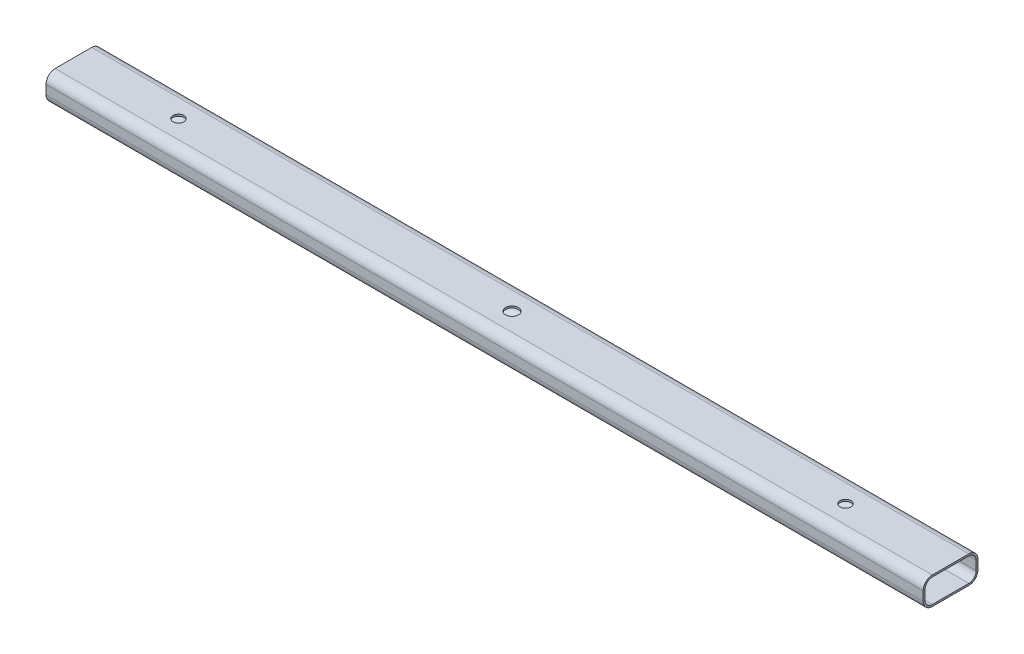
ISO-10303-21;
HEADER;
FILE_DESCRIPTION(('STEP AP214'),'2;1');
FILE_NAME('part.step','',(''),(''),'','','');
FILE_SCHEMA(('AUTOMOTIVE_DESIGN { 1 0 10303 214 1 1 1 1 }'));
ENDSEC;
DATA;
#1=APPLICATION_CONTEXT('core data for automotive mechanical design processes');
#2=APPLICATION_PROTOCOL_DEFINITION('international standard','automotive_design',2000,#1);
#3=PRODUCT_CONTEXT('',#1,'mechanical');
#4=PRODUCT('Part','Part','',(#3));
#5=PRODUCT_RELATED_PRODUCT_CATEGORY('part','',(#4));
#6=PRODUCT_DEFINITION_FORMATION('','',#4);
#7=PRODUCT_DEFINITION_CONTEXT('part definition',#1,'design');
#8=PRODUCT_DEFINITION('design','',#6,#7);
#9=PRODUCT_DEFINITION_SHAPE('','',#8);
#10=(LENGTH_UNIT() NAMED_UNIT(*) SI_UNIT(.MILLI.,.METRE.));
#11=(NAMED_UNIT(*) PLANE_ANGLE_UNIT() SI_UNIT($,.RADIAN.));
#12=(NAMED_UNIT(*) SI_UNIT($,.STERADIAN.) SOLID_ANGLE_UNIT());
#13=UNCERTAINTY_MEASURE_WITH_UNIT(LENGTH_MEASURE(1.E-05),#10,'distance_accuracy_value','');
#14=(GEOMETRIC_REPRESENTATION_CONTEXT(3) GLOBAL_UNCERTAINTY_ASSIGNED_CONTEXT((#13)) GLOBAL_UNIT_ASSIGNED_CONTEXT((#10,
#11,#12)) REPRESENTATION_CONTEXT('',''));
#15=CARTESIAN_POINT('',(0.,0.,0.));
#16=DIRECTION('',(0.,0.,1.));
#17=DIRECTION('',(1.,0.,0.));
#18=AXIS2_PLACEMENT_3D('',#15,#16,#17);
#19=CARTESIAN_POINT('',(480.,2.5,10.));
#20=DIRECTION('',(1.,0.,0.));
#21=DIRECTION('',(0.,0.,-1.));
#22=AXIS2_PLACEMENT_3D('',#19,#20,#21);
#23=PLANE('',#22);
#24=CARTESIAN_POINT('',(480.,2.5,10.));
#25=DIRECTION('',(1.,0.,0.));
#26=DIRECTION('',(0.,0.,1.));
#27=AXIS2_PLACEMENT_3D('',#24,#25,#26);
#28=CIRCLE('',#27,5.);
#29=CARTESIAN_POINT('',(480.,7.5,9.99999999999997));
#30=VERTEX_POINT('',#29);
#31=CARTESIAN_POINT('',(480.,2.49999999999996,15.));
#32=VERTEX_POINT('',#31);
#33=EDGE_CURVE('E264',#30,#32,#28,.T.);
#34=ORIENTED_EDGE('',*,*,#33,.T.);
#35=DIRECTION('',(0.,-1.,0.));
#36=VECTOR('',#35,1.);
#37=CARTESIAN_POINT('',(480.,-2.49999999999997,15.));
#38=LINE('',#37,#36);
#39=CARTESIAN_POINT('',(480.,-2.49999999999997,15.));
#40=VERTEX_POINT('',#39);
#41=EDGE_CURVE('E267',#32,#40,#38,.T.);
#42=ORIENTED_EDGE('',*,*,#41,.T.);
#43=CARTESIAN_POINT('',(480.,-2.5,10.));
#44=DIRECTION('',(1.,0.,0.));
#45=DIRECTION('',(0.,0.,1.));
#46=AXIS2_PLACEMENT_3D('',#43,#44,#45);
#47=CIRCLE('',#46,5.);
#48=CARTESIAN_POINT('',(480.,-7.5,9.99999999999996));
#49=VERTEX_POINT('',#48);
#50=EDGE_CURVE('E270',#40,#49,#47,.T.);
#51=ORIENTED_EDGE('',*,*,#50,.T.);
#52=DIRECTION('',(0.,0.,-1.));
#53=VECTOR('',#52,1.);
#54=CARTESIAN_POINT('',(480.,-7.5,9.99999999999997));
#55=LINE('',#54,#53);
#56=CARTESIAN_POINT('',(480.,-7.5,-9.99999999999996));
#57=VERTEX_POINT('',#56);
#58=EDGE_CURVE('E272',#49,#57,#55,.T.);
#59=ORIENTED_EDGE('',*,*,#58,.T.);
#60=CARTESIAN_POINT('',(480.,-2.5,-10.));
#61=DIRECTION('',(1.,0.,0.));
#62=DIRECTION('',(0.,0.,-1.));
#63=AXIS2_PLACEMENT_3D('',#60,#61,#62);
#64=CIRCLE('',#63,5.);
#65=CARTESIAN_POINT('',(480.,-2.5,-15.));
#66=VERTEX_POINT('',#65);
#67=EDGE_CURVE('E274',#57,#66,#64,.T.);
#68=ORIENTED_EDGE('',*,*,#67,.T.);
#69=DIRECTION('',(0.,1.,0.));
#70=VECTOR('',#69,1.);
#71=CARTESIAN_POINT('',(480.,-2.49999999999996,-15.));
#72=LINE('',#71,#70);
#73=CARTESIAN_POINT('',(480.,2.49999999999996,-15.));
#74=VERTEX_POINT('',#73);
#75=EDGE_CURVE('E276',#66,#74,#72,.T.);
#76=ORIENTED_EDGE('',*,*,#75,.T.);
#77=CARTESIAN_POINT('',(480.,2.5,-10.));
#78=DIRECTION('',(1.,0.,0.));
#79=DIRECTION('',(0.,0.,1.));
#80=AXIS2_PLACEMENT_3D('',#77,#78,#79);
#81=CIRCLE('',#80,5.);
#82=CARTESIAN_POINT('',(480.,7.5,-9.99999999999996));
#83=VERTEX_POINT('',#82);
#84=EDGE_CURVE('E278',#74,#83,#81,.T.);
#85=ORIENTED_EDGE('',*,*,#84,.T.);
#86=DIRECTION('',(0.,0.,1.));
#87=VECTOR('',#86,1.);
#88=CARTESIAN_POINT('',(480.,7.5,9.99999999999997));
#89=LINE('',#88,#87);
#90=EDGE_CURVE('E280',#83,#30,#89,.T.);
#91=ORIENTED_EDGE('',*,*,#90,.T.);
#92=EDGE_LOOP('',(#34,#42,#51,#59,#68,#76,#85,#91));
#93=FACE_BOUND('',#92,.T.);
#94=DIRECTION('',(0.,-1.,0.));
#95=VECTOR('',#94,1.);
#96=CARTESIAN_POINT('',(480.,2.5,14.));
#97=LINE('',#96,#95);
#98=CARTESIAN_POINT('',(480.,2.49999999999996,14.));
#99=VERTEX_POINT('',#98);
#100=CARTESIAN_POINT('',(480.,-2.49999999999997,14.));
#101=VERTEX_POINT('',#100);
#102=EDGE_CURVE('E205',#99,#101,#97,.T.);
#103=ORIENTED_EDGE('',*,*,#102,.F.);
#104=CARTESIAN_POINT('',(480.,2.5,10.));
#105=DIRECTION('',(-1.,0.,0.));
#106=DIRECTION('',(0.,0.,1.));
#107=AXIS2_PLACEMENT_3D('',#104,#105,#106);
#108=CIRCLE('',#107,4.);
#109=CARTESIAN_POINT('',(480.,6.5,9.99999999999997));
#110=VERTEX_POINT('',#109);
#111=EDGE_CURVE('E197',#110,#99,#108,.F.);
#112=ORIENTED_EDGE('',*,*,#111,.F.);
#113=DIRECTION('',(0.,0.,1.));
#114=VECTOR('',#113,1.);
#115=CARTESIAN_POINT('',(480.,6.5,10.));
#116=LINE('',#115,#114);
#117=CARTESIAN_POINT('',(480.,6.5,-9.99999999999997));
#118=VERTEX_POINT('',#117);
#119=EDGE_CURVE('E231',#118,#110,#116,.T.);
#120=ORIENTED_EDGE('',*,*,#119,.F.);
#121=CARTESIAN_POINT('',(480.,2.5,-10.));
#122=DIRECTION('',(-1.,0.,0.));
#123=DIRECTION('',(0.,0.,1.));
#124=AXIS2_PLACEMENT_3D('',#121,#122,#123);
#125=CIRCLE('',#124,4.);
#126=CARTESIAN_POINT('',(480.,2.49999999999996,-14.));
#127=VERTEX_POINT('',#126);
#128=EDGE_CURVE('E229',#127,#118,#125,.F.);
#129=ORIENTED_EDGE('',*,*,#128,.F.);
#130=DIRECTION('',(0.,1.,0.));
#131=VECTOR('',#130,1.);
#132=CARTESIAN_POINT('',(480.,2.5,-14.));
#133=LINE('',#132,#131);
#134=CARTESIAN_POINT('',(480.,-2.5,-14.));
#135=VERTEX_POINT('',#134);
#136=EDGE_CURVE('E227',#135,#127,#133,.T.);
#137=ORIENTED_EDGE('',*,*,#136,.F.);
#138=CARTESIAN_POINT('',(480.,-2.5,-10.));
#139=DIRECTION('',(-1.,0.,0.));
#140=DIRECTION('',(0.,0.,1.));
#141=AXIS2_PLACEMENT_3D('',#138,#139,#140);
#142=CIRCLE('',#141,4.);
#143=CARTESIAN_POINT('',(480.,-6.5,-9.99999999999996));
#144=VERTEX_POINT('',#143);
#145=EDGE_CURVE('E225',#144,#135,#142,.F.);
#146=ORIENTED_EDGE('',*,*,#145,.F.);
#147=DIRECTION('',(0.,0.,-1.));
#148=VECTOR('',#147,1.);
#149=CARTESIAN_POINT('',(480.,-6.5,10.));
#150=LINE('',#149,#148);
#151=CARTESIAN_POINT('',(480.,-6.5,9.99999999999997));
#152=VERTEX_POINT('',#151);
#153=EDGE_CURVE('E220',#152,#144,#150,.T.);
#154=ORIENTED_EDGE('',*,*,#153,.F.);
#155=CARTESIAN_POINT('',(480.,-2.5,10.));
#156=DIRECTION('',(-1.,0.,0.));
#157=DIRECTION('',(0.,0.,1.));
#158=AXIS2_PLACEMENT_3D('',#155,#156,#157);
#159=CIRCLE('',#158,4.);
#160=EDGE_CURVE('E218',#101,#152,#159,.F.);
#161=ORIENTED_EDGE('',*,*,#160,.F.);
#162=EDGE_LOOP('',(#103,#112,#120,#129,#137,#146,#154,#161));
#163=FACE_BOUND('',#162,.T.);
#164=ADVANCED_FACE('F82',(#93,#163),#23,.T.);
#165=CARTESIAN_POINT('',(0.,2.5,10.));
#166=DIRECTION('',(1.,0.,0.));
#167=DIRECTION('',(0.,0.,-1.));
#168=AXIS2_PLACEMENT_3D('',#165,#166,#167);
#169=PLANE('',#168);
#170=CARTESIAN_POINT('',(0.,2.5,10.));
#171=DIRECTION('',(1.,0.,0.));
#172=DIRECTION('',(0.,0.,1.));
#173=AXIS2_PLACEMENT_3D('',#170,#171,#172);
#174=CIRCLE('',#173,5.);
#175=CARTESIAN_POINT('',(0.,7.5,9.99999999999997));
#176=VERTEX_POINT('',#175);
#177=CARTESIAN_POINT('',(0.,2.49999999999996,15.));
#178=VERTEX_POINT('',#177);
#179=EDGE_CURVE('E213',#176,#178,#174,.T.);
#180=ORIENTED_EDGE('',*,*,#179,.F.);
#181=DIRECTION('',(0.,0.,1.));
#182=VECTOR('',#181,1.);
#183=CARTESIAN_POINT('',(0.,7.5,9.99999999999997));
#184=LINE('',#183,#182);
#185=CARTESIAN_POINT('',(0.,7.5,-9.99999999999996));
#186=VERTEX_POINT('',#185);
#187=EDGE_CURVE('E268',#186,#176,#184,.T.);
#188=ORIENTED_EDGE('',*,*,#187,.F.);
#189=CARTESIAN_POINT('',(0.,2.5,-10.));
#190=DIRECTION('',(1.,0.,0.));
#191=DIRECTION('',(0.,0.,1.));
#192=AXIS2_PLACEMENT_3D('',#189,#190,#191);
#193=CIRCLE('',#192,5.);
#194=CARTESIAN_POINT('',(0.,2.49999999999996,-15.));
#195=VERTEX_POINT('',#194);
#196=EDGE_CURVE('E295',#195,#186,#193,.T.);
#197=ORIENTED_EDGE('',*,*,#196,.F.);
#198=DIRECTION('',(0.,1.,0.));
#199=VECTOR('',#198,1.);
#200=CARTESIAN_POINT('',(0.,-2.49999999999996,-15.));
#201=LINE('',#200,#199);
#202=CARTESIAN_POINT('',(0.,-2.5,-15.));
#203=VERTEX_POINT('',#202);
#204=EDGE_CURVE('E293',#203,#195,#201,.T.);
#205=ORIENTED_EDGE('',*,*,#204,.F.);
#206=CARTESIAN_POINT('',(0.,-2.5,-10.));
#207=DIRECTION('',(1.,0.,0.));
#208=DIRECTION('',(0.,0.,-1.));
#209=AXIS2_PLACEMENT_3D('',#206,#207,#208);
#210=CIRCLE('',#209,5.);
#211=CARTESIAN_POINT('',(0.,-7.5,-9.99999999999996));
#212=VERTEX_POINT('',#211);
#213=EDGE_CURVE('E291',#212,#203,#210,.T.);
#214=ORIENTED_EDGE('',*,*,#213,.F.);
#215=DIRECTION('',(0.,0.,-1.));
#216=VECTOR('',#215,1.);
#217=CARTESIAN_POINT('',(0.,-7.5,9.99999999999997));
#218=LINE('',#217,#216);
#219=CARTESIAN_POINT('',(0.,-7.5,9.99999999999996));
#220=VERTEX_POINT('',#219);
#221=EDGE_CURVE('E289',#220,#212,#218,.T.);
#222=ORIENTED_EDGE('',*,*,#221,.F.);
#223=CARTESIAN_POINT('',(0.,-2.5,10.));
#224=DIRECTION('',(1.,0.,0.));
#225=DIRECTION('',(0.,0.,1.));
#226=AXIS2_PLACEMENT_3D('',#223,#224,#225);
#227=CIRCLE('',#226,5.);
#228=CARTESIAN_POINT('',(0.,-2.49999999999997,15.));
#229=VERTEX_POINT('',#228);
#230=EDGE_CURVE('E287',#229,#220,#227,.T.);
#231=ORIENTED_EDGE('',*,*,#230,.F.);
#232=DIRECTION('',(0.,-1.,0.));
#233=VECTOR('',#232,1.);
#234=CARTESIAN_POINT('',(0.,-2.49999999999997,15.));
#235=LINE('',#234,#233);
#236=EDGE_CURVE('E285',#178,#229,#235,.T.);
#237=ORIENTED_EDGE('',*,*,#236,.F.);
#238=EDGE_LOOP('',(#180,#188,#197,#205,#214,#222,#231,#237));
#239=FACE_BOUND('',#238,.T.);
#240=CARTESIAN_POINT('',(0.,2.5,10.));
#241=DIRECTION('',(-1.,0.,0.));
#242=DIRECTION('',(0.,0.,1.));
#243=AXIS2_PLACEMENT_3D('',#240,#241,#242);
#244=CIRCLE('',#243,4.);
#245=CARTESIAN_POINT('',(0.,6.5,9.99999999999997));
#246=VERTEX_POINT('',#245);
#247=CARTESIAN_POINT('',(0.,2.49999999999996,14.));
#248=VERTEX_POINT('',#247);
#249=EDGE_CURVE('E107',#246,#248,#244,.F.);
#250=ORIENTED_EDGE('',*,*,#249,.T.);
#251=DIRECTION('',(0.,-1.,0.));
#252=VECTOR('',#251,1.);
#253=CARTESIAN_POINT('',(0.,2.5,14.));
#254=LINE('',#253,#252);
#255=CARTESIAN_POINT('',(0.,-2.49999999999997,14.));
#256=VERTEX_POINT('',#255);
#257=EDGE_CURVE('E212',#248,#256,#254,.T.);
#258=ORIENTED_EDGE('',*,*,#257,.T.);
#259=CARTESIAN_POINT('',(0.,-2.5,10.));
#260=DIRECTION('',(-1.,0.,0.));
#261=DIRECTION('',(0.,0.,1.));
#262=AXIS2_PLACEMENT_3D('',#259,#260,#261);
#263=CIRCLE('',#262,4.);
#264=CARTESIAN_POINT('',(0.,-6.5,9.99999999999997));
#265=VERTEX_POINT('',#264);
#266=EDGE_CURVE('E236',#256,#265,#263,.F.);
#267=ORIENTED_EDGE('',*,*,#266,.T.);
#268=DIRECTION('',(0.,0.,-1.));
#269=VECTOR('',#268,1.);
#270=CARTESIAN_POINT('',(0.,-6.5,10.));
#271=LINE('',#270,#269);
#272=CARTESIAN_POINT('',(0.,-6.5,-9.99999999999996));
#273=VERTEX_POINT('',#272);
#274=EDGE_CURVE('E239',#265,#273,#271,.T.);
#275=ORIENTED_EDGE('',*,*,#274,.T.);
#276=CARTESIAN_POINT('',(0.,-2.5,-10.));
#277=DIRECTION('',(-1.,0.,0.));
#278=DIRECTION('',(0.,0.,1.));
#279=AXIS2_PLACEMENT_3D('',#276,#277,#278);
#280=CIRCLE('',#279,4.);
#281=CARTESIAN_POINT('',(0.,-2.5,-14.));
#282=VERTEX_POINT('',#281);
#283=EDGE_CURVE('E242',#273,#282,#280,.F.);
#284=ORIENTED_EDGE('',*,*,#283,.T.);
#285=DIRECTION('',(0.,1.,0.));
#286=VECTOR('',#285,1.);
#287=CARTESIAN_POINT('',(0.,2.5,-14.));
#288=LINE('',#287,#286);
#289=CARTESIAN_POINT('',(0.,2.49999999999996,-14.));
#290=VERTEX_POINT('',#289);
#291=EDGE_CURVE('E245',#282,#290,#288,.T.);
#292=ORIENTED_EDGE('',*,*,#291,.T.);
#293=CARTESIAN_POINT('',(0.,2.5,-10.));
#294=DIRECTION('',(-1.,0.,0.));
#295=DIRECTION('',(0.,0.,1.));
#296=AXIS2_PLACEMENT_3D('',#293,#294,#295);
#297=CIRCLE('',#296,4.);
#298=CARTESIAN_POINT('',(0.,6.5,-9.99999999999997));
#299=VERTEX_POINT('',#298);
#300=EDGE_CURVE('E248',#290,#299,#297,.F.);
#301=ORIENTED_EDGE('',*,*,#300,.T.);
#302=DIRECTION('',(0.,0.,1.));
#303=VECTOR('',#302,1.);
#304=CARTESIAN_POINT('',(0.,6.5,10.));
#305=LINE('',#304,#303);
#306=EDGE_CURVE('E206',#299,#246,#305,.T.);
#307=ORIENTED_EDGE('',*,*,#306,.T.);
#308=EDGE_LOOP('',(#250,#258,#267,#275,#284,#292,#301,#307));
#309=FACE_BOUND('',#308,.T.);
#310=ADVANCED_FACE('F354',(#239,#309),#169,.F.);
#311=CARTESIAN_POINT('',(480.,2.5,10.));
#312=DIRECTION('',(-1.,0.,0.));
#313=DIRECTION('',(0.,0.,1.));
#314=AXIS2_PLACEMENT_3D('',#311,#312,#313);
#315=CYLINDRICAL_SURFACE('',#314,5.);
#316=ORIENTED_EDGE('',*,*,#179,.T.);
#317=DIRECTION('',(-1.,0.,0.));
#318=VECTOR('',#317,1.);
#319=CARTESIAN_POINT('',(480.,2.49999999999996,15.));
#320=LINE('',#319,#318);
#321=EDGE_CURVE('E12',#32,#178,#320,.T.);
#322=ORIENTED_EDGE('',*,*,#321,.F.);
#323=ORIENTED_EDGE('',*,*,#33,.F.);
#324=DIRECTION('',(-1.,0.,0.));
#325=VECTOR('',#324,1.);
#326=CARTESIAN_POINT('',(480.,7.5,9.99999999999997));
#327=LINE('',#326,#325);
#328=EDGE_CURVE('E282',#30,#176,#327,.T.);
#329=ORIENTED_EDGE('',*,*,#328,.T.);
#330=EDGE_LOOP('',(#316,#322,#323,#329));
#331=FACE_BOUND('',#330,.T.);
#332=ADVANCED_FACE('F84',(#331),#315,.T.);
#333=CARTESIAN_POINT('',(480.,-2.49999999999997,15.));
#334=DIRECTION('',(0.,0.,-1.));
#335=DIRECTION('',(-1.,0.,0.));
#336=AXIS2_PLACEMENT_3D('',#333,#334,#335);
#337=PLANE('',#336);
#338=ORIENTED_EDGE('',*,*,#236,.T.);
#339=DIRECTION('',(-1.,0.,0.));
#340=VECTOR('',#339,1.);
#341=CARTESIAN_POINT('',(480.,-2.49999999999997,15.));
#342=LINE('',#341,#340);
#343=EDGE_CURVE('E91',#40,#229,#342,.T.);
#344=ORIENTED_EDGE('',*,*,#343,.F.);
#345=ORIENTED_EDGE('',*,*,#41,.F.);
#346=ORIENTED_EDGE('',*,*,#321,.T.);
#347=EDGE_LOOP('',(#338,#344,#345,#346));
#348=FACE_BOUND('',#347,.T.);
#349=ADVANCED_FACE('F416',(#348),#337,.F.);
#350=CARTESIAN_POINT('',(480.,-2.5,10.));
#351=DIRECTION('',(-1.,0.,0.));
#352=DIRECTION('',(0.,0.,1.));
#353=AXIS2_PLACEMENT_3D('',#350,#351,#352);
#354=CYLINDRICAL_SURFACE('',#353,5.);
#355=ORIENTED_EDGE('',*,*,#230,.T.);
#356=DIRECTION('',(-1.,0.,0.));
#357=VECTOR('',#356,1.);
#358=CARTESIAN_POINT('',(480.,-7.5,9.99999999999996));
#359=LINE('',#358,#357);
#360=EDGE_CURVE('E312',#49,#220,#359,.T.);
#361=ORIENTED_EDGE('',*,*,#360,.F.);
#362=ORIENTED_EDGE('',*,*,#50,.F.);
#363=ORIENTED_EDGE('',*,*,#343,.T.);
#364=EDGE_LOOP('',(#355,#361,#362,#363));
#365=FACE_BOUND('',#364,.T.);
#366=ADVANCED_FACE('F413',(#365),#354,.T.);
#367=CARTESIAN_POINT('',(480.,-7.5,9.99999999999997));
#368=DIRECTION('',(0.,1.,0.));
#369=DIRECTION('',(0.,0.,1.));
#370=AXIS2_PLACEMENT_3D('',#367,#368,#369);
#371=PLANE('',#370);
#372=CARTESIAN_POINT('',(422.5,-7.5,0.));
#373=DIRECTION('',(0.,1.,0.));
#374=DIRECTION('',(0.,0.,-1.));
#375=AXIS2_PLACEMENT_3D('',#372,#373,#374);
#376=CIRCLE('',#375,2.99999999999999);
#377=CARTESIAN_POINT('',(422.5,-7.5,-2.99999999999999));
#378=VERTEX_POINT('',#377);
#379=EDGE_CURVE('E603',#378,#378,#376,.T.);
#380=ORIENTED_EDGE('',*,*,#379,.T.);
#381=EDGE_LOOP('',(#380));
#382=FACE_BOUND('',#381,.T.);
#383=CARTESIAN_POINT('',(57.5,-7.5,0.));
#384=DIRECTION('',(0.,1.,0.));
#385=DIRECTION('',(0.,0.,1.));
#386=AXIS2_PLACEMENT_3D('',#383,#384,#385);
#387=CIRCLE('',#386,3.);
#388=CARTESIAN_POINT('',(57.5,-7.5,3.));
#389=VERTEX_POINT('',#388);
#390=EDGE_CURVE('E608',#389,#389,#387,.T.);
#391=ORIENTED_EDGE('',*,*,#390,.T.);
#392=EDGE_LOOP('',(#391));
#393=FACE_BOUND('',#392,.T.);
#394=CARTESIAN_POINT('',(240.,-7.5,0.));
#395=DIRECTION('',(0.,1.,0.));
#396=DIRECTION('',(0.,0.,1.));
#397=AXIS2_PLACEMENT_3D('',#394,#395,#396);
#398=CIRCLE('',#397,3.49999999999999);
#399=CARTESIAN_POINT('',(240.,-7.5,3.49999999999999));
#400=VERTEX_POINT('',#399);
#401=EDGE_CURVE('E320',#400,#400,#398,.T.);
#402=ORIENTED_EDGE('',*,*,#401,.T.);
#403=EDGE_LOOP('',(#402));
#404=FACE_BOUND('',#403,.T.);
#405=ORIENTED_EDGE('',*,*,#221,.T.);
#406=DIRECTION('',(-1.,0.,0.));
#407=VECTOR('',#406,1.);
#408=CARTESIAN_POINT('',(480.,-7.5,-9.99999999999996));
#409=LINE('',#408,#407);
#410=EDGE_CURVE('E309',#57,#212,#409,.T.);
#411=ORIENTED_EDGE('',*,*,#410,.F.);
#412=ORIENTED_EDGE('',*,*,#58,.F.);
#413=ORIENTED_EDGE('',*,*,#360,.T.);
#414=EDGE_LOOP('',(#405,#411,#412,#413));
#415=FACE_BOUND('',#414,.T.);
#416=ADVANCED_FACE('F409',(#382,#393,#404,#415),#371,.F.);
#417=CARTESIAN_POINT('',(480.,-2.5,-10.));
#418=DIRECTION('',(-1.,0.,0.));
#419=DIRECTION('',(0.,0.,1.));
#420=AXIS2_PLACEMENT_3D('',#417,#418,#419);
#421=CYLINDRICAL_SURFACE('',#420,5.);
#422=ORIENTED_EDGE('',*,*,#213,.T.);
#423=DIRECTION('',(-1.,0.,0.));
#424=VECTOR('',#423,1.);
#425=CARTESIAN_POINT('',(480.,-2.5,-15.));
#426=LINE('',#425,#424);
#427=EDGE_CURVE('E306',#66,#203,#426,.T.);
#428=ORIENTED_EDGE('',*,*,#427,.F.);
#429=ORIENTED_EDGE('',*,*,#67,.F.);
#430=ORIENTED_EDGE('',*,*,#410,.T.);
#431=EDGE_LOOP('',(#422,#428,#429,#430));
#432=FACE_BOUND('',#431,.T.);
#433=ADVANCED_FACE('F405',(#432),#421,.T.);
#434=CARTESIAN_POINT('',(480.,-2.49999999999996,-15.));
#435=DIRECTION('',(0.,0.,1.));
#436=DIRECTION('',(1.,0.,0.));
#437=AXIS2_PLACEMENT_3D('',#434,#435,#436);
#438=PLANE('',#437);
#439=ORIENTED_EDGE('',*,*,#204,.T.);
#440=DIRECTION('',(-1.,0.,0.));
#441=VECTOR('',#440,1.);
#442=CARTESIAN_POINT('',(480.,2.49999999999996,-15.));
#443=LINE('',#442,#441);
#444=EDGE_CURVE('E303',#74,#195,#443,.T.);
#445=ORIENTED_EDGE('',*,*,#444,.F.);
#446=ORIENTED_EDGE('',*,*,#75,.F.);
#447=ORIENTED_EDGE('',*,*,#427,.T.);
#448=EDGE_LOOP('',(#439,#445,#446,#447));
#449=FACE_BOUND('',#448,.T.);
#450=ADVANCED_FACE('F401',(#449),#438,.F.);
#451=CARTESIAN_POINT('',(480.,2.5,-10.));
#452=DIRECTION('',(-1.,0.,0.));
#453=DIRECTION('',(0.,0.,1.));
#454=AXIS2_PLACEMENT_3D('',#451,#452,#453);
#455=CYLINDRICAL_SURFACE('',#454,5.);
#456=ORIENTED_EDGE('',*,*,#196,.T.);
#457=DIRECTION('',(-1.,0.,0.));
#458=VECTOR('',#457,1.);
#459=CARTESIAN_POINT('',(480.,7.5,-9.99999999999996));
#460=LINE('',#459,#458);
#461=EDGE_CURVE('E300',#83,#186,#460,.T.);
#462=ORIENTED_EDGE('',*,*,#461,.F.);
#463=ORIENTED_EDGE('',*,*,#84,.F.);
#464=ORIENTED_EDGE('',*,*,#444,.T.);
#465=EDGE_LOOP('',(#456,#462,#463,#464));
#466=FACE_BOUND('',#465,.T.);
#467=ADVANCED_FACE('F397',(#466),#455,.T.);
#468=CARTESIAN_POINT('',(480.,7.5,9.99999999999997));
#469=DIRECTION('',(0.,-1.,0.));
#470=DIRECTION('',(0.,0.,-1.));
#471=AXIS2_PLACEMENT_3D('',#468,#469,#470);
#472=PLANE('',#471);
#473=CARTESIAN_POINT('',(422.5,7.5,0.));
#474=DIRECTION('',(0.,1.,0.));
#475=DIRECTION('',(0.,0.,-1.));
#476=AXIS2_PLACEMENT_3D('',#473,#474,#475);
#477=CIRCLE('',#476,2.99999999999999);
#478=CARTESIAN_POINT('',(422.5,7.5,-2.99999999999999));
#479=VERTEX_POINT('',#478);
#480=EDGE_CURVE('E605',#479,#479,#477,.T.);
#481=ORIENTED_EDGE('',*,*,#480,.F.);
#482=EDGE_LOOP('',(#481));
#483=FACE_BOUND('',#482,.T.);
#484=CARTESIAN_POINT('',(57.5,7.5,0.));
#485=DIRECTION('',(0.,1.,0.));
#486=DIRECTION('',(0.,0.,1.));
#487=AXIS2_PLACEMENT_3D('',#484,#485,#486);
#488=CIRCLE('',#487,3.);
#489=CARTESIAN_POINT('',(57.5,7.5,3.));
#490=VERTEX_POINT('',#489);
#491=EDGE_CURVE('E604',#490,#490,#488,.T.);
#492=ORIENTED_EDGE('',*,*,#491,.F.);
#493=EDGE_LOOP('',(#492));
#494=FACE_BOUND('',#493,.T.);
#495=CARTESIAN_POINT('',(240.,7.5,0.));
#496=DIRECTION('',(0.,1.,0.));
#497=DIRECTION('',(0.,0.,1.));
#498=AXIS2_PLACEMENT_3D('',#495,#496,#497);
#499=CIRCLE('',#498,3.49999999999999);
#500=CARTESIAN_POINT('',(240.,7.5,3.49999999999999));
#501=VERTEX_POINT('',#500);
#502=EDGE_CURVE('E333',#501,#501,#499,.T.);
#503=ORIENTED_EDGE('',*,*,#502,.F.);
#504=EDGE_LOOP('',(#503));
#505=FACE_BOUND('',#504,.T.);
#506=ORIENTED_EDGE('',*,*,#187,.T.);
#507=ORIENTED_EDGE('',*,*,#328,.F.);
#508=ORIENTED_EDGE('',*,*,#90,.F.);
#509=ORIENTED_EDGE('',*,*,#461,.T.);
#510=EDGE_LOOP('',(#506,#507,#508,#509));
#511=FACE_BOUND('',#510,.T.);
#512=ADVANCED_FACE('F394',(#483,#494,#505,#511),#472,.F.);
#513=CARTESIAN_POINT('',(480.,2.5,10.));
#514=DIRECTION('',(-1.,0.,0.));
#515=DIRECTION('',(0.,0.,1.));
#516=AXIS2_PLACEMENT_3D('',#513,#514,#515);
#517=CYLINDRICAL_SURFACE('',#516,4.);
#518=ORIENTED_EDGE('',*,*,#249,.F.);
#519=DIRECTION('',(-1.,0.,0.));
#520=VECTOR('',#519,1.);
#521=CARTESIAN_POINT('',(480.,6.5,9.99999999999997));
#522=LINE('',#521,#520);
#523=EDGE_CURVE('E201',#110,#246,#522,.T.);
#524=ORIENTED_EDGE('',*,*,#523,.F.);
#525=ORIENTED_EDGE('',*,*,#111,.T.);
#526=DIRECTION('',(-1.,0.,0.));
#527=VECTOR('',#526,1.);
#528=CARTESIAN_POINT('',(480.,2.49999999999996,14.));
#529=LINE('',#528,#527);
#530=EDGE_CURVE('E200',#99,#248,#529,.T.);
#531=ORIENTED_EDGE('',*,*,#530,.T.);
#532=EDGE_LOOP('',(#518,#524,#525,#531));
#533=FACE_BOUND('',#532,.T.);
#534=ADVANCED_FACE('F199',(#533),#517,.F.);
#535=CARTESIAN_POINT('',(480.,2.5,14.));
#536=DIRECTION('',(0.,0.,-1.));
#537=DIRECTION('',(-1.,0.,0.));
#538=AXIS2_PLACEMENT_3D('',#535,#536,#537);
#539=PLANE('',#538);
#540=ORIENTED_EDGE('',*,*,#257,.F.);
#541=ORIENTED_EDGE('',*,*,#530,.F.);
#542=ORIENTED_EDGE('',*,*,#102,.T.);
#543=DIRECTION('',(-1.,0.,0.));
#544=VECTOR('',#543,1.);
#545=CARTESIAN_POINT('',(480.,-2.49999999999997,14.));
#546=LINE('',#545,#544);
#547=EDGE_CURVE('E214',#101,#256,#546,.T.);
#548=ORIENTED_EDGE('',*,*,#547,.T.);
#549=EDGE_LOOP('',(#540,#541,#542,#548));
#550=FACE_BOUND('',#549,.T.);
#551=ADVANCED_FACE('F209',(#550),#539,.T.);
#552=CARTESIAN_POINT('',(480.,-2.5,10.));
#553=DIRECTION('',(-1.,0.,0.));
#554=DIRECTION('',(0.,0.,1.));
#555=AXIS2_PLACEMENT_3D('',#552,#553,#554);
#556=CYLINDRICAL_SURFACE('',#555,4.);
#557=ORIENTED_EDGE('',*,*,#266,.F.);
#558=ORIENTED_EDGE('',*,*,#547,.F.);
#559=ORIENTED_EDGE('',*,*,#160,.T.);
#560=DIRECTION('',(-1.,0.,0.));
#561=VECTOR('',#560,1.);
#562=CARTESIAN_POINT('',(480.,-6.5,9.99999999999997));
#563=LINE('',#562,#561);
#564=EDGE_CURVE('E261',#152,#265,#563,.T.);
#565=ORIENTED_EDGE('',*,*,#564,.T.);
#566=EDGE_LOOP('',(#557,#558,#559,#565));
#567=FACE_BOUND('',#566,.T.);
#568=ADVANCED_FACE('F374',(#567),#556,.F.);
#569=CARTESIAN_POINT('',(480.,-6.5,10.));
#570=DIRECTION('',(0.,1.,0.));
#571=DIRECTION('',(0.,0.,1.));
#572=AXIS2_PLACEMENT_3D('',#569,#570,#571);
#573=PLANE('',#572);
#574=CARTESIAN_POINT('',(422.5,-6.5,0.));
#575=DIRECTION('',(0.,1.,0.));
#576=DIRECTION('',(0.,0.,1.));
#577=AXIS2_PLACEMENT_3D('',#574,#575,#576);
#578=CIRCLE('',#577,2.99999999999999);
#579=CARTESIAN_POINT('',(422.5,-6.5,2.99999999999999));
#580=VERTEX_POINT('',#579);
#581=EDGE_CURVE('E234',#580,#580,#578,.T.);
#582=ORIENTED_EDGE('',*,*,#581,.F.);
#583=EDGE_LOOP('',(#582));
#584=FACE_BOUND('',#583,.T.);
#585=CARTESIAN_POINT('',(57.5,-6.5,0.));
#586=DIRECTION('',(0.,1.,0.));
#587=DIRECTION('',(0.,0.,1.));
#588=AXIS2_PLACEMENT_3D('',#585,#586,#587);
#589=CIRCLE('',#588,3.);
#590=CARTESIAN_POINT('',(57.5,-6.5,3.));
#591=VERTEX_POINT('',#590);
#592=EDGE_CURVE('E323',#591,#591,#589,.T.);
#593=ORIENTED_EDGE('',*,*,#592,.F.);
#594=EDGE_LOOP('',(#593));
#595=FACE_BOUND('',#594,.T.);
#596=CARTESIAN_POINT('',(240.,-6.5,0.));
#597=DIRECTION('',(0.,1.,0.));
#598=DIRECTION('',(0.,0.,1.));
#599=AXIS2_PLACEMENT_3D('',#596,#597,#598);
#600=CIRCLE('',#599,3.49999999999999);
#601=CARTESIAN_POINT('',(240.,-6.5,3.49999999999999));
#602=VERTEX_POINT('',#601);
#603=EDGE_CURVE('E319',#602,#602,#600,.T.);
#604=ORIENTED_EDGE('',*,*,#603,.F.);
#605=EDGE_LOOP('',(#604));
#606=FACE_BOUND('',#605,.T.);
#607=ORIENTED_EDGE('',*,*,#274,.F.);
#608=ORIENTED_EDGE('',*,*,#564,.F.);
#609=ORIENTED_EDGE('',*,*,#153,.T.);
#610=DIRECTION('',(-1.,0.,0.));
#611=VECTOR('',#610,1.);
#612=CARTESIAN_POINT('',(480.,-6.5,-9.99999999999996));
#613=LINE('',#612,#611);
#614=EDGE_CURVE('E259',#144,#273,#613,.T.);
#615=ORIENTED_EDGE('',*,*,#614,.T.);
#616=EDGE_LOOP('',(#607,#608,#609,#615));
#617=FACE_BOUND('',#616,.T.);
#618=ADVANCED_FACE('F370',(#584,#595,#606,#617),#573,.T.);
#619=CARTESIAN_POINT('',(480.,-2.5,-10.));
#620=DIRECTION('',(-1.,0.,0.));
#621=DIRECTION('',(0.,0.,1.));
#622=AXIS2_PLACEMENT_3D('',#619,#620,#621);
#623=CYLINDRICAL_SURFACE('',#622,4.);
#624=ORIENTED_EDGE('',*,*,#283,.F.);
#625=ORIENTED_EDGE('',*,*,#614,.F.);
#626=ORIENTED_EDGE('',*,*,#145,.T.);
#627=DIRECTION('',(-1.,0.,0.));
#628=VECTOR('',#627,1.);
#629=CARTESIAN_POINT('',(480.,-2.5,-14.));
#630=LINE('',#629,#628);
#631=EDGE_CURVE('E257',#135,#282,#630,.T.);
#632=ORIENTED_EDGE('',*,*,#631,.T.);
#633=EDGE_LOOP('',(#624,#625,#626,#632));
#634=FACE_BOUND('',#633,.T.);
#635=ADVANCED_FACE('F366',(#634),#623,.F.);
#636=CARTESIAN_POINT('',(480.,2.5,-14.));
#637=DIRECTION('',(0.,0.,1.));
#638=DIRECTION('',(1.,0.,0.));
#639=AXIS2_PLACEMENT_3D('',#636,#637,#638);
#640=PLANE('',#639);
#641=ORIENTED_EDGE('',*,*,#291,.F.);
#642=ORIENTED_EDGE('',*,*,#631,.F.);
#643=ORIENTED_EDGE('',*,*,#136,.T.);
#644=DIRECTION('',(-1.,0.,0.));
#645=VECTOR('',#644,1.);
#646=CARTESIAN_POINT('',(480.,2.49999999999996,-14.));
#647=LINE('',#646,#645);
#648=EDGE_CURVE('E255',#127,#290,#647,.T.);
#649=ORIENTED_EDGE('',*,*,#648,.T.);
#650=EDGE_LOOP('',(#641,#642,#643,#649));
#651=FACE_BOUND('',#650,.T.);
#652=ADVANCED_FACE('F363',(#651),#640,.T.);
#653=CARTESIAN_POINT('',(480.,2.5,-10.));
#654=DIRECTION('',(-1.,0.,0.));
#655=DIRECTION('',(0.,0.,1.));
#656=AXIS2_PLACEMENT_3D('',#653,#654,#655);
#657=CYLINDRICAL_SURFACE('',#656,4.);
#658=ORIENTED_EDGE('',*,*,#300,.F.);
#659=ORIENTED_EDGE('',*,*,#648,.F.);
#660=ORIENTED_EDGE('',*,*,#128,.T.);
#661=DIRECTION('',(-1.,0.,0.));
#662=VECTOR('',#661,1.);
#663=CARTESIAN_POINT('',(480.,6.5,-9.99999999999997));
#664=LINE('',#663,#662);
#665=EDGE_CURVE('E99',#118,#299,#664,.T.);
#666=ORIENTED_EDGE('',*,*,#665,.T.);
#667=EDGE_LOOP('',(#658,#659,#660,#666));
#668=FACE_BOUND('',#667,.T.);
#669=ADVANCED_FACE('F348',(#668),#657,.F.);
#670=CARTESIAN_POINT('',(480.,6.5,10.));
#671=DIRECTION('',(0.,-1.,0.));
#672=DIRECTION('',(0.,0.,-1.));
#673=AXIS2_PLACEMENT_3D('',#670,#671,#672);
#674=PLANE('',#673);
#675=CARTESIAN_POINT('',(422.5,6.5,0.));
#676=DIRECTION('',(0.,-1.,0.));
#677=DIRECTION('',(0.,0.,-1.));
#678=AXIS2_PLACEMENT_3D('',#675,#676,#677);
#679=CIRCLE('',#678,2.99999999999999);
#680=CARTESIAN_POINT('',(422.5,6.5,-2.99999999999999));
#681=VERTEX_POINT('',#680);
#682=EDGE_CURVE('E86',#681,#681,#679,.T.);
#683=ORIENTED_EDGE('',*,*,#682,.F.);
#684=EDGE_LOOP('',(#683));
#685=FACE_BOUND('',#684,.T.);
#686=CARTESIAN_POINT('',(57.5,6.5,0.));
#687=DIRECTION('',(0.,-1.,0.));
#688=DIRECTION('',(0.,0.,-1.));
#689=AXIS2_PLACEMENT_3D('',#686,#687,#688);
#690=CIRCLE('',#689,3.);
#691=CARTESIAN_POINT('',(57.5,6.5,-3.));
#692=VERTEX_POINT('',#691);
#693=EDGE_CURVE('E321',#692,#692,#690,.T.);
#694=ORIENTED_EDGE('',*,*,#693,.F.);
#695=EDGE_LOOP('',(#694));
#696=FACE_BOUND('',#695,.T.);
#697=CARTESIAN_POINT('',(240.,6.5,0.));
#698=DIRECTION('',(0.,-1.,0.));
#699=DIRECTION('',(0.,0.,-1.));
#700=AXIS2_PLACEMENT_3D('',#697,#698,#699);
#701=CIRCLE('',#700,3.49999999999999);
#702=CARTESIAN_POINT('',(240.,6.5,-3.5));
#703=VERTEX_POINT('',#702);
#704=EDGE_CURVE('E317',#703,#703,#701,.T.);
#705=ORIENTED_EDGE('',*,*,#704,.F.);
#706=EDGE_LOOP('',(#705));
#707=FACE_BOUND('',#706,.T.);
#708=ORIENTED_EDGE('',*,*,#306,.F.);
#709=ORIENTED_EDGE('',*,*,#665,.F.);
#710=ORIENTED_EDGE('',*,*,#119,.T.);
#711=ORIENTED_EDGE('',*,*,#523,.T.);
#712=EDGE_LOOP('',(#708,#709,#710,#711));
#713=FACE_BOUND('',#712,.T.);
#714=ADVANCED_FACE('F344',(#685,#696,#707,#713),#674,.T.);
#715=CARTESIAN_POINT('',(240.,-7.5,0.));
#716=DIRECTION('',(0.,1.,0.));
#717=DIRECTION('',(0.,0.,1.));
#718=AXIS2_PLACEMENT_3D('',#715,#716,#717);
#719=CYLINDRICAL_SURFACE('',#718,3.49999999999999);
#720=ORIENTED_EDGE('',*,*,#704,.T.);
#721=EDGE_LOOP('',(#720));
#722=FACE_BOUND('',#721,.T.);
#723=ORIENTED_EDGE('',*,*,#502,.T.);
#724=EDGE_LOOP('',(#723));
#725=FACE_BOUND('',#724,.T.);
#726=ADVANCED_FACE('F347',(#722,#725),#719,.F.);
#727=CARTESIAN_POINT('',(57.5,-7.5,0.));
#728=DIRECTION('',(0.,1.,0.));
#729=DIRECTION('',(0.,0.,1.));
#730=AXIS2_PLACEMENT_3D('',#727,#728,#729);
#731=CYLINDRICAL_SURFACE('',#730,3.);
#732=ORIENTED_EDGE('',*,*,#693,.T.);
#733=EDGE_LOOP('',(#732));
#734=FACE_BOUND('',#733,.T.);
#735=ORIENTED_EDGE('',*,*,#491,.T.);
#736=EDGE_LOOP('',(#735));
#737=FACE_BOUND('',#736,.T.);
#738=ADVANCED_FACE('F550',(#734,#737),#731,.F.);
#739=CARTESIAN_POINT('',(422.5,-7.5,0.));
#740=DIRECTION('',(0.,1.,0.));
#741=DIRECTION('',(0.,0.,1.));
#742=AXIS2_PLACEMENT_3D('',#739,#740,#741);
#743=CYLINDRICAL_SURFACE('',#742,2.99999999999999);
#744=ORIENTED_EDGE('',*,*,#682,.T.);
#745=EDGE_LOOP('',(#744));
#746=FACE_BOUND('',#745,.T.);
#747=ORIENTED_EDGE('',*,*,#480,.T.);
#748=EDGE_LOOP('',(#747));
#749=FACE_BOUND('',#748,.T.);
#750=ADVANCED_FACE('F341',(#746,#749),#743,.F.);
#751=ORIENTED_EDGE('',*,*,#603,.T.);
#752=EDGE_LOOP('',(#751));
#753=FACE_BOUND('',#752,.T.);
#754=ORIENTED_EDGE('',*,*,#401,.F.);
#755=EDGE_LOOP('',(#754));
#756=FACE_BOUND('',#755,.T.);
#757=ADVANCED_FACE('F553',(#753,#756),#719,.F.);
#758=ORIENTED_EDGE('',*,*,#592,.T.);
#759=EDGE_LOOP('',(#758));
#760=FACE_BOUND('',#759,.T.);
#761=ORIENTED_EDGE('',*,*,#390,.F.);
#762=EDGE_LOOP('',(#761));
#763=FACE_BOUND('',#762,.T.);
#764=ADVANCED_FACE('F561',(#760,#763),#731,.F.);
#765=ORIENTED_EDGE('',*,*,#581,.T.);
#766=EDGE_LOOP('',(#765));
#767=FACE_BOUND('',#766,.T.);
#768=ORIENTED_EDGE('',*,*,#379,.F.);
#769=EDGE_LOOP('',(#768));
#770=FACE_BOUND('',#769,.T.);
#771=ADVANCED_FACE('F569',(#767,#770),#743,.F.);
#772=CLOSED_SHELL('',(#164,#310,#332,#349,#366,#416,#433,#450,#467,#512,#534,#551,#568,#618,
#635,#652,#669,#714,#726,#738,#750,#757,#764,#771));
#773=MANIFOLD_SOLID_BREP('B2',#772);
#774=ADVANCED_BREP_SHAPE_REPRESENTATION('',(#18,#773),#14);
#775=SHAPE_DEFINITION_REPRESENTATION(#9,#774);
ENDSEC;
END-ISO-10303-21;
